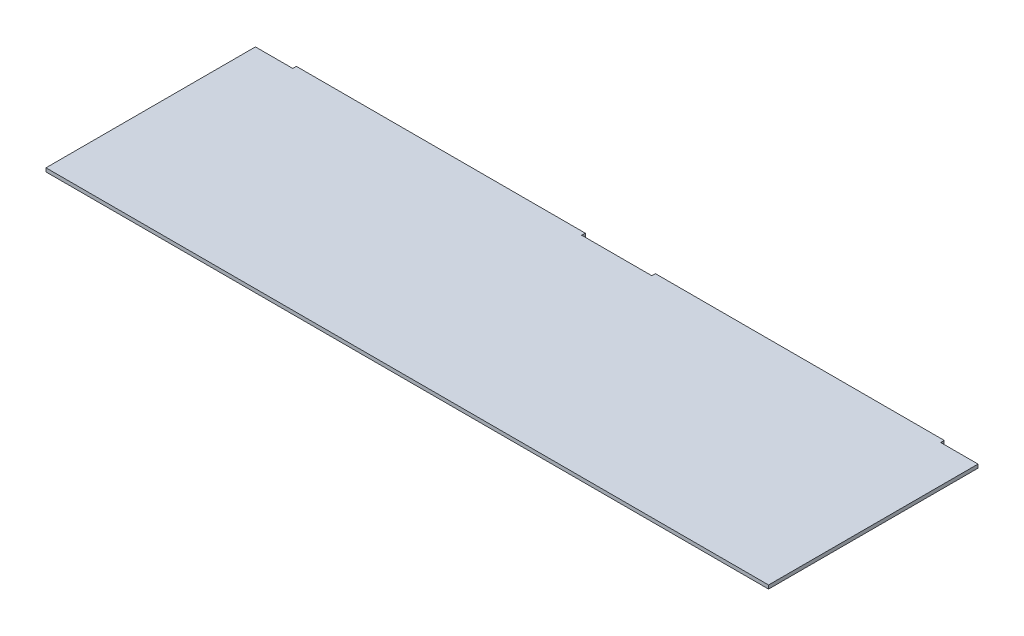
ISO-10303-21;
HEADER;
FILE_DESCRIPTION(('STEP AP214'),'2;1');
FILE_NAME('part.step','',(''),(''),'','','');
FILE_SCHEMA(('AUTOMOTIVE_DESIGN { 1 0 10303 214 1 1 1 1 }'));
ENDSEC;
DATA;
#1=APPLICATION_CONTEXT('core data for automotive mechanical design processes');
#2=APPLICATION_PROTOCOL_DEFINITION('international standard','automotive_design',2000,#1);
#3=PRODUCT_CONTEXT('',#1,'mechanical');
#4=PRODUCT('Part','Part','',(#3));
#5=PRODUCT_RELATED_PRODUCT_CATEGORY('part','',(#4));
#6=PRODUCT_DEFINITION_FORMATION('','',#4);
#7=PRODUCT_DEFINITION_CONTEXT('part definition',#1,'design');
#8=PRODUCT_DEFINITION('design','',#6,#7);
#9=PRODUCT_DEFINITION_SHAPE('','',#8);
#10=(LENGTH_UNIT() NAMED_UNIT(*) SI_UNIT(.MILLI.,.METRE.));
#11=(NAMED_UNIT(*) PLANE_ANGLE_UNIT() SI_UNIT($,.RADIAN.));
#12=(NAMED_UNIT(*) SI_UNIT($,.STERADIAN.) SOLID_ANGLE_UNIT());
#13=UNCERTAINTY_MEASURE_WITH_UNIT(LENGTH_MEASURE(1.E-05),#10,'distance_accuracy_value','');
#14=(GEOMETRIC_REPRESENTATION_CONTEXT(3) GLOBAL_UNCERTAINTY_ASSIGNED_CONTEXT((#13)) GLOBAL_UNIT_ASSIGNED_CONTEXT((#10,
#11,#12)) REPRESENTATION_CONTEXT('',''));
#15=CARTESIAN_POINT('',(0.,0.,0.));
#16=DIRECTION('',(0.,0.,1.));
#17=DIRECTION('',(1.,0.,0.));
#18=AXIS2_PLACEMENT_3D('',#15,#16,#17);
#19=CARTESIAN_POINT('',(-317.6778,1.5875,-92.075));
#20=DIRECTION('',(0.,0.,1.));
#21=DIRECTION('',(1.,0.,0.));
#22=AXIS2_PLACEMENT_3D('',#19,#20,#21);
#23=PLANE('',#22);
#24=DIRECTION('',(0.,-1.,0.));
#25=VECTOR('',#24,1.);
#26=CARTESIAN_POINT('',(284.822900000001,-1.58750000000007,-92.075));
#27=LINE('',#26,#25);
#28=CARTESIAN_POINT('',(284.822900000002,1.5875,-92.075));
#29=VERTEX_POINT('',#28);
#30=CARTESIAN_POINT('',(284.822900000002,-1.5875,-92.075));
#31=VERTEX_POINT('',#30);
#32=EDGE_CURVE('E56',#29,#31,#27,.T.);
#33=ORIENTED_EDGE('',*,*,#32,.F.);
#34=DIRECTION('',(-1.,0.,0.));
#35=VECTOR('',#34,1.);
#36=CARTESIAN_POINT('',(-317.6778,1.5875,-92.075));
#37=LINE('',#36,#35);
#38=CARTESIAN_POINT('',(317.6778,1.5875,-92.075));
#39=VERTEX_POINT('',#38);
#40=EDGE_CURVE('E184',#39,#29,#37,.T.);
#41=ORIENTED_EDGE('',*,*,#40,.F.);
#42=DIRECTION('',(0.,-1.,0.));
#43=VECTOR('',#42,1.);
#44=CARTESIAN_POINT('',(317.6778,1.5875,-92.075));
#45=LINE('',#44,#43);
#46=CARTESIAN_POINT('',(317.6778,-1.5875,-92.075));
#47=VERTEX_POINT('',#46);
#48=EDGE_CURVE('E11',#39,#47,#45,.T.);
#49=ORIENTED_EDGE('',*,*,#48,.T.);
#50=DIRECTION('',(-1.,0.,0.));
#51=VECTOR('',#50,1.);
#52=CARTESIAN_POINT('',(-317.6778,-1.5875,-92.075));
#53=LINE('',#52,#51);
#54=EDGE_CURVE('E194',#47,#31,#53,.T.);
#55=ORIENTED_EDGE('',*,*,#54,.T.);
#56=EDGE_LOOP('',(#33,#41,#49,#55));
#57=FACE_BOUND('',#56,.T.);
#58=ADVANCED_FACE('F33',(#57),#23,.F.);
#59=DIRECTION('',(0.,1.,0.));
#60=VECTOR('',#59,1.);
#61=CARTESIAN_POINT('',(30.8229000000015,1.58749999999994,-92.075));
#62=LINE('',#61,#60);
#63=CARTESIAN_POINT('',(30.8229000000015,-1.58750000000007,-92.075));
#64=VERTEX_POINT('',#63);
#65=CARTESIAN_POINT('',(30.8229000000014,1.5875,-92.075));
#66=VERTEX_POINT('',#65);
#67=EDGE_CURVE('E143',#64,#66,#62,.T.);
#68=ORIENTED_EDGE('',*,*,#67,.F.);
#69=CARTESIAN_POINT('',(-30.8229000000015,-1.5875,-92.075));
#70=VERTEX_POINT('',#69);
#71=EDGE_CURVE('E197',#64,#70,#53,.T.);
#72=ORIENTED_EDGE('',*,*,#71,.T.);
#73=DIRECTION('',(0.,-1.,0.));
#74=VECTOR('',#73,1.);
#75=CARTESIAN_POINT('',(-30.8229000000015,-1.58750000000007,-92.075));
#76=LINE('',#75,#74);
#77=CARTESIAN_POINT('',(-30.8229000000015,1.5875,-92.075));
#78=VERTEX_POINT('',#77);
#79=EDGE_CURVE('E146',#78,#70,#76,.T.);
#80=ORIENTED_EDGE('',*,*,#79,.F.);
#81=EDGE_CURVE('E48',#66,#78,#37,.T.);
#82=ORIENTED_EDGE('',*,*,#81,.F.);
#83=EDGE_LOOP('',(#68,#72,#80,#82));
#84=FACE_BOUND('',#83,.T.);
#85=ADVANCED_FACE('F230',(#84),#23,.F.);
#86=DIRECTION('',(0.,1.,0.));
#87=VECTOR('',#86,1.);
#88=CARTESIAN_POINT('',(-284.822900000001,1.58749999999994,-92.075));
#89=LINE('',#88,#87);
#90=CARTESIAN_POINT('',(-284.822900000001,-1.5875,-92.075));
#91=VERTEX_POINT('',#90);
#92=CARTESIAN_POINT('',(-284.822900000001,1.58749999999994,-92.075));
#93=VERTEX_POINT('',#92);
#94=EDGE_CURVE('E149',#91,#93,#89,.T.);
#95=ORIENTED_EDGE('',*,*,#94,.F.);
#96=CARTESIAN_POINT('',(-317.6778,-1.5875,-92.075));
#97=VERTEX_POINT('',#96);
#98=EDGE_CURVE('E193',#91,#97,#53,.T.);
#99=ORIENTED_EDGE('',*,*,#98,.T.);
#100=DIRECTION('',(0.,-1.,0.));
#101=VECTOR('',#100,1.);
#102=CARTESIAN_POINT('',(-317.6778,1.5875,-92.075));
#103=LINE('',#102,#101);
#104=CARTESIAN_POINT('',(-317.6778,1.5875,-92.075));
#105=VERTEX_POINT('',#104);
#106=EDGE_CURVE('E41',#105,#97,#103,.T.);
#107=ORIENTED_EDGE('',*,*,#106,.F.);
#108=EDGE_CURVE('E182',#93,#105,#37,.T.);
#109=ORIENTED_EDGE('',*,*,#108,.F.);
#110=EDGE_LOOP('',(#95,#99,#107,#109));
#111=FACE_BOUND('',#110,.T.);
#112=ADVANCED_FACE('F239',(#111),#23,.F.);
#113=CARTESIAN_POINT('',(317.6778,1.5875,-92.075));
#114=DIRECTION('',(-1.,0.,0.));
#115=DIRECTION('',(0.,0.,1.));
#116=AXIS2_PLACEMENT_3D('',#113,#114,#115);
#117=PLANE('',#116);
#118=DIRECTION('',(0.,0.,-1.));
#119=VECTOR('',#118,1.);
#120=CARTESIAN_POINT('',(317.6778,-1.5875,-92.075));
#121=LINE('',#120,#119);
#122=CARTESIAN_POINT('',(317.6778,-1.5875,92.075));
#123=VERTEX_POINT('',#122);
#124=EDGE_CURVE('E178',#123,#47,#121,.T.);
#125=ORIENTED_EDGE('',*,*,#124,.T.);
#126=ORIENTED_EDGE('',*,*,#48,.F.);
#127=DIRECTION('',(0.,0.,-1.));
#128=VECTOR('',#127,1.);
#129=CARTESIAN_POINT('',(317.6778,1.5875,-92.075));
#130=LINE('',#129,#128);
#131=CARTESIAN_POINT('',(317.6778,1.5875,92.075));
#132=VERTEX_POINT('',#131);
#133=EDGE_CURVE('E179',#132,#39,#130,.T.);
#134=ORIENTED_EDGE('',*,*,#133,.F.);
#135=DIRECTION('',(0.,-1.,0.));
#136=VECTOR('',#135,1.);
#137=CARTESIAN_POINT('',(317.6778,1.5875,92.075));
#138=LINE('',#137,#136);
#139=EDGE_CURVE('E190',#132,#123,#138,.T.);
#140=ORIENTED_EDGE('',*,*,#139,.T.);
#141=EDGE_LOOP('',(#125,#126,#134,#140));
#142=FACE_BOUND('',#141,.T.);
#143=ADVANCED_FACE('F35',(#142),#117,.F.);
#144=CARTESIAN_POINT('',(-317.6778,1.5875,-92.075));
#145=DIRECTION('',(1.,0.,0.));
#146=DIRECTION('',(0.,0.,-1.));
#147=AXIS2_PLACEMENT_3D('',#144,#145,#146);
#148=PLANE('',#147);
#149=DIRECTION('',(0.,0.,1.));
#150=VECTOR('',#149,1.);
#151=CARTESIAN_POINT('',(-317.6778,-1.5875,-92.075));
#152=LINE('',#151,#150);
#153=CARTESIAN_POINT('',(-317.6778,-1.5875,92.075));
#154=VERTEX_POINT('',#153);
#155=EDGE_CURVE('E196',#97,#154,#152,.T.);
#156=ORIENTED_EDGE('',*,*,#155,.T.);
#157=DIRECTION('',(0.,-1.,0.));
#158=VECTOR('',#157,1.);
#159=CARTESIAN_POINT('',(-317.6778,1.5875,92.075));
#160=LINE('',#159,#158);
#161=CARTESIAN_POINT('',(-317.6778,1.5875,92.075));
#162=VERTEX_POINT('',#161);
#163=EDGE_CURVE('E202',#162,#154,#160,.T.);
#164=ORIENTED_EDGE('',*,*,#163,.F.);
#165=DIRECTION('',(0.,0.,1.));
#166=VECTOR('',#165,1.);
#167=CARTESIAN_POINT('',(-317.6778,1.5875,-92.075));
#168=LINE('',#167,#166);
#169=EDGE_CURVE('E186',#105,#162,#168,.T.);
#170=ORIENTED_EDGE('',*,*,#169,.F.);
#171=ORIENTED_EDGE('',*,*,#106,.T.);
#172=EDGE_LOOP('',(#156,#164,#170,#171));
#173=FACE_BOUND('',#172,.T.);
#174=ADVANCED_FACE('F209',(#173),#148,.F.);
#175=CARTESIAN_POINT('',(-317.6778,1.5875,92.075));
#176=DIRECTION('',(0.,0.,-1.));
#177=DIRECTION('',(-1.,0.,0.));
#178=AXIS2_PLACEMENT_3D('',#175,#176,#177);
#179=PLANE('',#178);
#180=DIRECTION('',(1.,0.,0.));
#181=VECTOR('',#180,1.);
#182=CARTESIAN_POINT('',(-317.6778,-1.5875,92.075));
#183=LINE('',#182,#181);
#184=EDGE_CURVE('E183',#154,#123,#183,.T.);
#185=ORIENTED_EDGE('',*,*,#184,.T.);
#186=ORIENTED_EDGE('',*,*,#139,.F.);
#187=DIRECTION('',(1.,0.,0.));
#188=VECTOR('',#187,1.);
#189=CARTESIAN_POINT('',(-317.6778,1.5875,92.075));
#190=LINE('',#189,#188);
#191=EDGE_CURVE('E188',#162,#132,#190,.T.);
#192=ORIENTED_EDGE('',*,*,#191,.F.);
#193=ORIENTED_EDGE('',*,*,#163,.T.);
#194=EDGE_LOOP('',(#185,#186,#192,#193));
#195=FACE_BOUND('',#194,.T.);
#196=ADVANCED_FACE('F217',(#195),#179,.F.);
#197=CARTESIAN_POINT('',(0.,1.5875,0.));
#198=DIRECTION('',(0.,1.,0.));
#199=DIRECTION('',(0.,0.,1.));
#200=AXIS2_PLACEMENT_3D('',#197,#198,#199);
#201=PLANE('',#200);
#202=ORIENTED_EDGE('',*,*,#133,.T.);
#203=ORIENTED_EDGE('',*,*,#40,.T.);
#204=DIRECTION('',(0.,0.,1.));
#205=VECTOR('',#204,1.);
#206=CARTESIAN_POINT('',(284.822900000001,1.58749999999994,-95.25));
#207=LINE('',#206,#205);
#208=CARTESIAN_POINT('',(284.822900000001,1.58749999999994,-95.25));
#209=VERTEX_POINT('',#208);
#210=EDGE_CURVE('E366',#209,#29,#207,.T.);
#211=ORIENTED_EDGE('',*,*,#210,.F.);
#212=DIRECTION('',(1.,0.,0.));
#213=VECTOR('',#212,1.);
#214=CARTESIAN_POINT('',(284.822900000001,1.58749999999994,-95.25));
#215=LINE('',#214,#213);
#216=CARTESIAN_POINT('',(30.8229000000015,1.58749999999994,-95.25));
#217=VERTEX_POINT('',#216);
#218=EDGE_CURVE('E139',#217,#209,#215,.T.);
#219=ORIENTED_EDGE('',*,*,#218,.F.);
#220=DIRECTION('',(0.,0.,1.));
#221=VECTOR('',#220,1.);
#222=CARTESIAN_POINT('',(30.8229000000015,1.58749999999994,-95.25));
#223=LINE('',#222,#221);
#224=EDGE_CURVE('E151',#217,#66,#223,.T.);
#225=ORIENTED_EDGE('',*,*,#224,.T.);
#226=ORIENTED_EDGE('',*,*,#81,.T.);
#227=DIRECTION('',(0.,0.,1.));
#228=VECTOR('',#227,1.);
#229=CARTESIAN_POINT('',(-30.8229000000015,1.58749999999994,-95.25));
#230=LINE('',#229,#228);
#231=CARTESIAN_POINT('',(-30.8229000000015,1.58749999999994,-95.25));
#232=VERTEX_POINT('',#231);
#233=EDGE_CURVE('E163',#232,#78,#230,.T.);
#234=ORIENTED_EDGE('',*,*,#233,.F.);
#235=DIRECTION('',(1.,0.,0.));
#236=VECTOR('',#235,1.);
#237=CARTESIAN_POINT('',(-30.8229000000015,1.58749999999994,-95.25));
#238=LINE('',#237,#236);
#239=CARTESIAN_POINT('',(-284.822900000001,1.58749999999994,-95.25));
#240=VERTEX_POINT('',#239);
#241=EDGE_CURVE('E162',#240,#232,#238,.T.);
#242=ORIENTED_EDGE('',*,*,#241,.F.);
#243=DIRECTION('',(0.,0.,1.));
#244=VECTOR('',#243,1.);
#245=CARTESIAN_POINT('',(-284.822900000001,1.58749999999994,-95.25));
#246=LINE('',#245,#244);
#247=EDGE_CURVE('E169',#240,#93,#246,.T.);
#248=ORIENTED_EDGE('',*,*,#247,.T.);
#249=ORIENTED_EDGE('',*,*,#108,.T.);
#250=ORIENTED_EDGE('',*,*,#169,.T.);
#251=ORIENTED_EDGE('',*,*,#191,.T.);
#252=EDGE_LOOP('',(#202,#203,#211,#219,#225,#226,#234,#242,#248,#249,#250,#251));
#253=FACE_BOUND('',#252,.T.);
#254=ADVANCED_FACE('F223',(#253),#201,.T.);
#255=CARTESIAN_POINT('',(0.,-1.5875,0.));
#256=DIRECTION('',(0.,1.,0.));
#257=DIRECTION('',(0.,0.,1.));
#258=AXIS2_PLACEMENT_3D('',#255,#256,#257);
#259=PLANE('',#258);
#260=ORIENTED_EDGE('',*,*,#124,.F.);
#261=ORIENTED_EDGE('',*,*,#184,.F.);
#262=ORIENTED_EDGE('',*,*,#155,.F.);
#263=ORIENTED_EDGE('',*,*,#98,.F.);
#264=DIRECTION('',(0.,0.,1.));
#265=VECTOR('',#264,1.);
#266=CARTESIAN_POINT('',(-284.822900000001,-1.58750000000007,-95.25));
#267=LINE('',#266,#265);
#268=CARTESIAN_POINT('',(-284.822900000001,-1.58750000000007,-95.25));
#269=VERTEX_POINT('',#268);
#270=EDGE_CURVE('E172',#269,#91,#267,.T.);
#271=ORIENTED_EDGE('',*,*,#270,.F.);
#272=DIRECTION('',(-1.,0.,0.));
#273=VECTOR('',#272,1.);
#274=CARTESIAN_POINT('',(-30.8229000000015,-1.58750000000007,-95.25));
#275=LINE('',#274,#273);
#276=CARTESIAN_POINT('',(-30.8229000000015,-1.58750000000007,-95.25));
#277=VERTEX_POINT('',#276);
#278=EDGE_CURVE('E158',#277,#269,#275,.T.);
#279=ORIENTED_EDGE('',*,*,#278,.F.);
#280=DIRECTION('',(0.,0.,1.));
#281=VECTOR('',#280,1.);
#282=CARTESIAN_POINT('',(-30.8229000000015,-1.58750000000007,-95.25));
#283=LINE('',#282,#281);
#284=EDGE_CURVE('E175',#277,#70,#283,.T.);
#285=ORIENTED_EDGE('',*,*,#284,.T.);
#286=ORIENTED_EDGE('',*,*,#71,.F.);
#287=DIRECTION('',(0.,0.,1.));
#288=VECTOR('',#287,1.);
#289=CARTESIAN_POINT('',(30.8229000000015,-1.58750000000007,-95.25));
#290=LINE('',#289,#288);
#291=CARTESIAN_POINT('',(30.8229000000015,-1.58750000000007,-95.25));
#292=VERTEX_POINT('',#291);
#293=EDGE_CURVE('E130',#292,#64,#290,.T.);
#294=ORIENTED_EDGE('',*,*,#293,.F.);
#295=DIRECTION('',(-1.,0.,0.));
#296=VECTOR('',#295,1.);
#297=CARTESIAN_POINT('',(284.822900000001,-1.58750000000007,-95.25));
#298=LINE('',#297,#296);
#299=CARTESIAN_POINT('',(284.822900000001,-1.58750000000007,-95.25));
#300=VERTEX_POINT('',#299);
#301=EDGE_CURVE('E123',#300,#292,#298,.T.);
#302=ORIENTED_EDGE('',*,*,#301,.F.);
#303=DIRECTION('',(0.,0.,1.));
#304=VECTOR('',#303,1.);
#305=CARTESIAN_POINT('',(284.822900000001,-1.58750000000007,-95.25));
#306=LINE('',#305,#304);
#307=EDGE_CURVE('E128',#300,#31,#306,.T.);
#308=ORIENTED_EDGE('',*,*,#307,.T.);
#309=ORIENTED_EDGE('',*,*,#54,.F.);
#310=EDGE_LOOP('',(#260,#261,#262,#263,#271,#279,#285,#286,#294,#302,#308,#309));
#311=FACE_BOUND('',#310,.T.);
#312=ADVANCED_FACE('F126',(#311),#259,.F.);
#313=CARTESIAN_POINT('',(-30.8229000000015,-1.58750000000007,-95.25));
#314=DIRECTION('',(-1.,0.,0.));
#315=DIRECTION('',(0.,0.,1.));
#316=AXIS2_PLACEMENT_3D('',#313,#314,#315);
#317=PLANE('',#316);
#318=ORIENTED_EDGE('',*,*,#79,.T.);
#319=ORIENTED_EDGE('',*,*,#284,.F.);
#320=DIRECTION('',(0.,-1.,0.));
#321=VECTOR('',#320,1.);
#322=CARTESIAN_POINT('',(-30.8229000000015,-1.58750000000007,-95.25));
#323=LINE('',#322,#321);
#324=EDGE_CURVE('E155',#232,#277,#323,.T.);
#325=ORIENTED_EDGE('',*,*,#324,.F.);
#326=ORIENTED_EDGE('',*,*,#233,.T.);
#327=EDGE_LOOP('',(#318,#319,#325,#326));
#328=FACE_BOUND('',#327,.T.);
#329=ADVANCED_FACE('F233',(#328),#317,.F.);
#330=CARTESIAN_POINT('',(-284.822900000001,1.58749999999994,-95.25));
#331=DIRECTION('',(1.,0.,0.));
#332=DIRECTION('',(0.,1.,0.));
#333=AXIS2_PLACEMENT_3D('',#330,#331,#332);
#334=PLANE('',#333);
#335=ORIENTED_EDGE('',*,*,#94,.T.);
#336=ORIENTED_EDGE('',*,*,#247,.F.);
#337=DIRECTION('',(0.,1.,0.));
#338=VECTOR('',#337,1.);
#339=CARTESIAN_POINT('',(-284.822900000001,1.58749999999994,-95.25));
#340=LINE('',#339,#338);
#341=EDGE_CURVE('E160',#269,#240,#340,.T.);
#342=ORIENTED_EDGE('',*,*,#341,.F.);
#343=ORIENTED_EDGE('',*,*,#270,.T.);
#344=EDGE_LOOP('',(#335,#336,#342,#343));
#345=FACE_BOUND('',#344,.T.);
#346=ADVANCED_FACE('F238',(#345),#334,.F.);
#347=CARTESIAN_POINT('',(0.,0.,-95.25));
#348=DIRECTION('',(0.,0.,1.));
#349=DIRECTION('',(1.,0.,0.));
#350=AXIS2_PLACEMENT_3D('',#347,#348,#349);
#351=PLANE('',#350);
#352=ORIENTED_EDGE('',*,*,#324,.T.);
#353=ORIENTED_EDGE('',*,*,#278,.T.);
#354=ORIENTED_EDGE('',*,*,#341,.T.);
#355=ORIENTED_EDGE('',*,*,#241,.T.);
#356=EDGE_LOOP('',(#352,#353,#354,#355));
#357=FACE_BOUND('',#356,.T.);
#358=ADVANCED_FACE('F235',(#357),#351,.F.);
#359=CARTESIAN_POINT('',(284.822900000001,-1.58750000000007,-95.25));
#360=DIRECTION('',(-1.,0.,0.));
#361=DIRECTION('',(0.,-1.,0.));
#362=AXIS2_PLACEMENT_3D('',#359,#360,#361);
#363=PLANE('',#362);
#364=ORIENTED_EDGE('',*,*,#32,.T.);
#365=ORIENTED_EDGE('',*,*,#307,.F.);
#366=DIRECTION('',(0.,-1.,0.));
#367=VECTOR('',#366,1.);
#368=CARTESIAN_POINT('',(284.822900000001,-1.58750000000007,-95.25));
#369=LINE('',#368,#367);
#370=EDGE_CURVE('E134',#209,#300,#369,.T.);
#371=ORIENTED_EDGE('',*,*,#370,.F.);
#372=ORIENTED_EDGE('',*,*,#210,.T.);
#373=EDGE_LOOP('',(#364,#365,#371,#372));
#374=FACE_BOUND('',#373,.T.);
#375=ADVANCED_FACE('F145',(#374),#363,.F.);
#376=CARTESIAN_POINT('',(30.8229000000015,1.58749999999994,-95.25));
#377=DIRECTION('',(1.,0.,0.));
#378=DIRECTION('',(0.,0.,-1.));
#379=AXIS2_PLACEMENT_3D('',#376,#377,#378);
#380=PLANE('',#379);
#381=ORIENTED_EDGE('',*,*,#67,.T.);
#382=ORIENTED_EDGE('',*,*,#224,.F.);
#383=DIRECTION('',(0.,1.,0.));
#384=VECTOR('',#383,1.);
#385=CARTESIAN_POINT('',(30.8229000000015,1.58749999999994,-95.25));
#386=LINE('',#385,#384);
#387=EDGE_CURVE('E133',#292,#217,#386,.T.);
#388=ORIENTED_EDGE('',*,*,#387,.F.);
#389=ORIENTED_EDGE('',*,*,#293,.T.);
#390=EDGE_LOOP('',(#381,#382,#388,#389));
#391=FACE_BOUND('',#390,.T.);
#392=ADVANCED_FACE('F311',(#391),#380,.F.);
#393=CARTESIAN_POINT('',(0.,0.,-95.25));
#394=DIRECTION('',(0.,0.,1.));
#395=DIRECTION('',(1.,0.,0.));
#396=AXIS2_PLACEMENT_3D('',#393,#394,#395);
#397=PLANE('',#396);
#398=ORIENTED_EDGE('',*,*,#370,.T.);
#399=ORIENTED_EDGE('',*,*,#301,.T.);
#400=ORIENTED_EDGE('',*,*,#387,.T.);
#401=ORIENTED_EDGE('',*,*,#218,.T.);
#402=EDGE_LOOP('',(#398,#399,#400,#401));
#403=FACE_BOUND('',#402,.T.);
#404=ADVANCED_FACE('F137',(#403),#397,.F.);
#405=CLOSED_SHELL('',(#58,#85,#112,#143,#174,#196,#254,#312,#329,#346,#358,#375,#392,#404));
#406=MANIFOLD_SOLID_BREP('B2',#405);
#407=ADVANCED_BREP_SHAPE_REPRESENTATION('',(#18,#406),#14);
#408=SHAPE_DEFINITION_REPRESENTATION(#9,#407);
ENDSEC;
END-ISO-10303-21;
